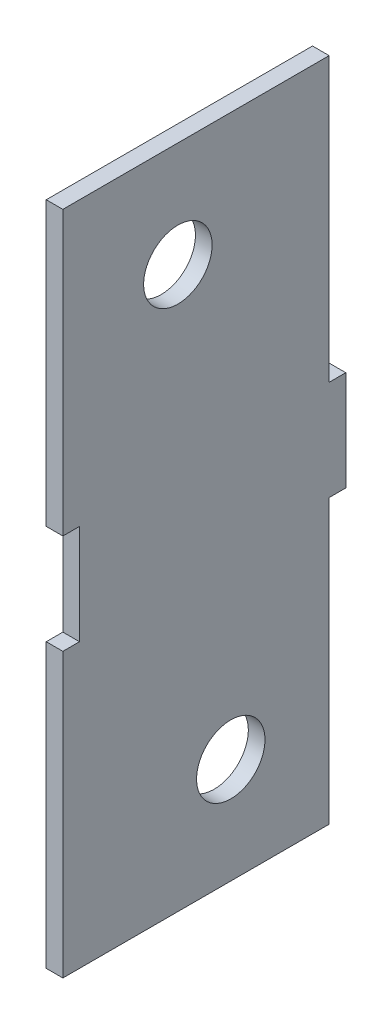
ISO-10303-21;
HEADER;
FILE_DESCRIPTION(('STEP AP214'),'2;1');
FILE_NAME('part.step','',(''),(''),'','','');
FILE_SCHEMA(('AUTOMOTIVE_DESIGN { 1 0 10303 214 1 1 1 1 }'));
ENDSEC;
DATA;
#1=APPLICATION_CONTEXT('core data for automotive mechanical design processes');
#2=APPLICATION_PROTOCOL_DEFINITION('international standard','automotive_design',2000,#1);
#3=PRODUCT_CONTEXT('',#1,'mechanical');
#4=PRODUCT('Part','Part','',(#3));
#5=PRODUCT_RELATED_PRODUCT_CATEGORY('part','',(#4));
#6=PRODUCT_DEFINITION_FORMATION('','',#4);
#7=PRODUCT_DEFINITION_CONTEXT('part definition',#1,'design');
#8=PRODUCT_DEFINITION('design','',#6,#7);
#9=PRODUCT_DEFINITION_SHAPE('','',#8);
#10=(LENGTH_UNIT() NAMED_UNIT(*) SI_UNIT(.MILLI.,.METRE.));
#11=(NAMED_UNIT(*) PLANE_ANGLE_UNIT() SI_UNIT($,.RADIAN.));
#12=(NAMED_UNIT(*) SI_UNIT($,.STERADIAN.) SOLID_ANGLE_UNIT());
#13=UNCERTAINTY_MEASURE_WITH_UNIT(LENGTH_MEASURE(1.E-05),#10,'distance_accuracy_value','');
#14=(GEOMETRIC_REPRESENTATION_CONTEXT(3) GLOBAL_UNCERTAINTY_ASSIGNED_CONTEXT((#13)) GLOBAL_UNIT_ASSIGNED_CONTEXT((#10,
#11,#12)) REPRESENTATION_CONTEXT('',''));
#15=CARTESIAN_POINT('',(0.,0.,0.));
#16=DIRECTION('',(0.,0.,1.));
#17=DIRECTION('',(1.,0.,0.));
#18=AXIS2_PLACEMENT_3D('',#15,#16,#17);
#19=CARTESIAN_POINT('',(1.5875,0.,0.));
#20=DIRECTION('',(-1.,0.,0.));
#21=DIRECTION('',(0.,0.,1.));
#22=AXIS2_PLACEMENT_3D('',#19,#20,#21);
#23=PLANE('',#22);
#24=CARTESIAN_POINT('',(1.5875,-21.6977850407598,-3.31693456022971));
#25=DIRECTION('',(1.,0.,0.));
#26=DIRECTION('',(0.,0.,-1.));
#27=AXIS2_PLACEMENT_3D('',#24,#25,#26);
#28=CIRCLE('',#27,3.2639);
#29=CARTESIAN_POINT('',(1.5875,-21.6977850407598,-6.58083456022971));
#30=VERTEX_POINT('',#29);
#31=EDGE_CURVE('E182',#30,#30,#28,.T.);
#32=ORIENTED_EDGE('',*,*,#31,.F.);
#33=EDGE_LOOP('',(#32));
#34=FACE_BOUND('',#33,.T.);
#35=CARTESIAN_POINT('',(1.5875,21.6977850407598,1.7294345602297));
#36=DIRECTION('',(1.,0.,0.));
#37=DIRECTION('',(0.,0.,-1.));
#38=AXIS2_PLACEMENT_3D('',#35,#36,#37);
#39=CIRCLE('',#38,3.2639);
#40=CARTESIAN_POINT('',(1.5875,21.6977850407598,-1.5344654397703));
#41=VERTEX_POINT('',#40);
#42=EDGE_CURVE('E188',#41,#41,#39,.T.);
#43=ORIENTED_EDGE('',*,*,#42,.F.);
#44=EDGE_LOOP('',(#43));
#45=FACE_BOUND('',#44,.T.);
#46=DIRECTION('',(0.,0.,-1.));
#47=VECTOR('',#46,1.);
#48=CARTESIAN_POINT('',(1.5875,4.7625,12.7));
#49=LINE('',#48,#47);
#50=CARTESIAN_POINT('',(1.5875,4.7625,12.7));
#51=VERTEX_POINT('',#50);
#52=CARTESIAN_POINT('',(1.5875,4.7625,11.1125));
#53=VERTEX_POINT('',#52);
#54=EDGE_CURVE('E135',#51,#53,#49,.T.);
#55=ORIENTED_EDGE('',*,*,#54,.T.);
#56=DIRECTION('',(0.,-1.,0.));
#57=VECTOR('',#56,1.);
#58=CARTESIAN_POINT('',(1.5875,4.7625,11.1125));
#59=LINE('',#58,#57);
#60=CARTESIAN_POINT('',(1.5875,-4.7625,11.1125));
#61=VERTEX_POINT('',#60);
#62=EDGE_CURVE('E143',#53,#61,#59,.T.);
#63=ORIENTED_EDGE('',*,*,#62,.T.);
#64=DIRECTION('',(0.,0.,-1.));
#65=VECTOR('',#64,1.);
#66=CARTESIAN_POINT('',(1.5875,-4.7625,12.7));
#67=LINE('',#66,#65);
#68=CARTESIAN_POINT('',(1.5875,-4.7625,12.7));
#69=VERTEX_POINT('',#68);
#70=EDGE_CURVE('E148',#69,#61,#67,.T.);
#71=ORIENTED_EDGE('',*,*,#70,.F.);
#72=DIRECTION('',(0.,-1.,0.));
#73=VECTOR('',#72,1.);
#74=CARTESIAN_POINT('',(1.5875,-31.75,12.7));
#75=LINE('',#74,#73);
#76=CARTESIAN_POINT('',(1.5875,-31.75,12.7));
#77=VERTEX_POINT('',#76);
#78=EDGE_CURVE('E200',#69,#77,#75,.T.);
#79=ORIENTED_EDGE('',*,*,#78,.T.);
#80=DIRECTION('',(0.,0.,-1.));
#81=VECTOR('',#80,1.);
#82=CARTESIAN_POINT('',(1.5875,-31.75,12.7));
#83=LINE('',#82,#81);
#84=CARTESIAN_POINT('',(1.5875,-31.75,-12.7));
#85=VERTEX_POINT('',#84);
#86=EDGE_CURVE('E202',#77,#85,#83,.T.);
#87=ORIENTED_EDGE('',*,*,#86,.T.);
#88=DIRECTION('',(0.,1.,0.));
#89=VECTOR('',#88,1.);
#90=CARTESIAN_POINT('',(1.5875,-31.75,-12.7));
#91=LINE('',#90,#89);
#92=CARTESIAN_POINT('',(1.5875,-4.7625,-12.7));
#93=VERTEX_POINT('',#92);
#94=EDGE_CURVE('E194',#85,#93,#91,.T.);
#95=ORIENTED_EDGE('',*,*,#94,.T.);
#96=DIRECTION('',(0.,0.,-1.));
#97=VECTOR('',#96,1.);
#98=CARTESIAN_POINT('',(1.5875,-4.7625,-12.7));
#99=LINE('',#98,#97);
#100=CARTESIAN_POINT('',(1.5875,-4.7625,-14.2875));
#101=VERTEX_POINT('',#100);
#102=EDGE_CURVE('E65',#93,#101,#99,.T.);
#103=ORIENTED_EDGE('',*,*,#102,.T.);
#104=DIRECTION('',(0.,-1.,0.));
#105=VECTOR('',#104,1.);
#106=CARTESIAN_POINT('',(1.5875,4.7625,-14.2875));
#107=LINE('',#106,#105);
#108=CARTESIAN_POINT('',(1.5875,4.7625,-14.2875));
#109=VERTEX_POINT('',#108);
#110=EDGE_CURVE('E169',#109,#101,#107,.T.);
#111=ORIENTED_EDGE('',*,*,#110,.F.);
#112=DIRECTION('',(0.,0.,-1.));
#113=VECTOR('',#112,1.);
#114=CARTESIAN_POINT('',(1.5875,4.7625,-12.7));
#115=LINE('',#114,#113);
#116=CARTESIAN_POINT('',(1.5875,4.7625,-12.7));
#117=VERTEX_POINT('',#116);
#118=EDGE_CURVE('E163',#117,#109,#115,.T.);
#119=ORIENTED_EDGE('',*,*,#118,.F.);
#120=CARTESIAN_POINT('',(1.5875,31.75,-12.7));
#121=VERTEX_POINT('',#120);
#122=EDGE_CURVE('E198',#117,#121,#91,.T.);
#123=ORIENTED_EDGE('',*,*,#122,.T.);
#124=DIRECTION('',(0.,0.,1.));
#125=VECTOR('',#124,1.);
#126=CARTESIAN_POINT('',(1.5875,31.75,12.7));
#127=LINE('',#126,#125);
#128=CARTESIAN_POINT('',(1.5875,31.75,12.7));
#129=VERTEX_POINT('',#128);
#130=EDGE_CURVE('E197',#121,#129,#127,.T.);
#131=ORIENTED_EDGE('',*,*,#130,.T.);
#132=EDGE_CURVE('E152',#129,#51,#75,.T.);
#133=ORIENTED_EDGE('',*,*,#132,.T.);
#134=EDGE_LOOP('',(#55,#63,#71,#79,#87,#95,#103,#111,#119,#123,#131,#133));
#135=FACE_BOUND('',#134,.T.);
#136=ADVANCED_FACE('F42',(#34,#45,#135),#23,.F.);
#137=CARTESIAN_POINT('',(0.,0.,0.));
#138=DIRECTION('',(-1.,0.,0.));
#139=DIRECTION('',(0.,0.,1.));
#140=AXIS2_PLACEMENT_3D('',#137,#138,#139);
#141=PLANE('',#140);
#142=CARTESIAN_POINT('',(0.,21.6977850407598,1.7294345602297));
#143=DIRECTION('',(1.,0.,0.));
#144=DIRECTION('',(0.,0.,-1.));
#145=AXIS2_PLACEMENT_3D('',#142,#143,#144);
#146=CIRCLE('',#145,3.2639);
#147=CARTESIAN_POINT('',(0.,21.6977850407598,-1.5344654397703));
#148=VERTEX_POINT('',#147);
#149=EDGE_CURVE('E185',#148,#148,#146,.T.);
#150=ORIENTED_EDGE('',*,*,#149,.T.);
#151=EDGE_LOOP('',(#150));
#152=FACE_BOUND('',#151,.T.);
#153=CARTESIAN_POINT('',(0.,-21.6977850407598,-3.31693456022971));
#154=DIRECTION('',(1.,0.,0.));
#155=DIRECTION('',(0.,0.,-1.));
#156=AXIS2_PLACEMENT_3D('',#153,#154,#155);
#157=CIRCLE('',#156,3.2639);
#158=CARTESIAN_POINT('',(0.,-21.6977850407598,-6.58083456022971));
#159=VERTEX_POINT('',#158);
#160=EDGE_CURVE('E175',#159,#159,#157,.T.);
#161=ORIENTED_EDGE('',*,*,#160,.T.);
#162=EDGE_LOOP('',(#161));
#163=FACE_BOUND('',#162,.T.);
#164=DIRECTION('',(0.,1.,0.));
#165=VECTOR('',#164,1.);
#166=CARTESIAN_POINT('',(0.,0.,11.1125));
#167=LINE('',#166,#165);
#168=CARTESIAN_POINT('',(0.,-4.7625,11.1125));
#169=VERTEX_POINT('',#168);
#170=CARTESIAN_POINT('',(0.,4.7625,11.1125));
#171=VERTEX_POINT('',#170);
#172=EDGE_CURVE('E11',#169,#171,#167,.T.);
#173=ORIENTED_EDGE('',*,*,#172,.T.);
#174=DIRECTION('',(0.,0.,1.));
#175=VECTOR('',#174,1.);
#176=CARTESIAN_POINT('',(0.,4.7625,0.));
#177=LINE('',#176,#175);
#178=CARTESIAN_POINT('',(0.,4.7625,12.7));
#179=VERTEX_POINT('',#178);
#180=EDGE_CURVE('E138',#171,#179,#177,.T.);
#181=ORIENTED_EDGE('',*,*,#180,.T.);
#182=DIRECTION('',(0.,-1.,0.));
#183=VECTOR('',#182,1.);
#184=CARTESIAN_POINT('',(0.,-31.75,12.7));
#185=LINE('',#184,#183);
#186=CARTESIAN_POINT('',(0.,31.75,12.7));
#187=VERTEX_POINT('',#186);
#188=EDGE_CURVE('E211',#187,#179,#185,.T.);
#189=ORIENTED_EDGE('',*,*,#188,.F.);
#190=DIRECTION('',(0.,0.,1.));
#191=VECTOR('',#190,1.);
#192=CARTESIAN_POINT('',(0.,31.75,12.7));
#193=LINE('',#192,#191);
#194=CARTESIAN_POINT('',(0.,31.75,-12.7));
#195=VERTEX_POINT('',#194);
#196=EDGE_CURVE('E208',#195,#187,#193,.T.);
#197=ORIENTED_EDGE('',*,*,#196,.F.);
#198=DIRECTION('',(0.,1.,0.));
#199=VECTOR('',#198,1.);
#200=CARTESIAN_POINT('',(0.,-31.75,-12.7));
#201=LINE('',#200,#199);
#202=CARTESIAN_POINT('',(0.,4.7625,-12.7));
#203=VERTEX_POINT('',#202);
#204=EDGE_CURVE('E191',#203,#195,#201,.T.);
#205=ORIENTED_EDGE('',*,*,#204,.F.);
#206=DIRECTION('',(0.,0.,-1.));
#207=VECTOR('',#206,1.);
#208=CARTESIAN_POINT('',(0.,4.7625,-12.7));
#209=LINE('',#208,#207);
#210=CARTESIAN_POINT('',(0.,4.7625,-14.2875));
#211=VERTEX_POINT('',#210);
#212=EDGE_CURVE('E165',#203,#211,#209,.T.);
#213=ORIENTED_EDGE('',*,*,#212,.T.);
#214=DIRECTION('',(0.,-1.,0.));
#215=VECTOR('',#214,1.);
#216=CARTESIAN_POINT('',(0.,4.7625,-14.2875));
#217=LINE('',#216,#215);
#218=CARTESIAN_POINT('',(0.,-4.7625,-14.2875));
#219=VERTEX_POINT('',#218);
#220=EDGE_CURVE('E162',#211,#219,#217,.T.);
#221=ORIENTED_EDGE('',*,*,#220,.T.);
#222=DIRECTION('',(0.,0.,-1.));
#223=VECTOR('',#222,1.);
#224=CARTESIAN_POINT('',(0.,-4.7625,-12.7));
#225=LINE('',#224,#223);
#226=CARTESIAN_POINT('',(0.,-4.7625,-12.7));
#227=VERTEX_POINT('',#226);
#228=EDGE_CURVE('E159',#227,#219,#225,.T.);
#229=ORIENTED_EDGE('',*,*,#228,.F.);
#230=CARTESIAN_POINT('',(0.,-31.75,-12.7));
#231=VERTEX_POINT('',#230);
#232=EDGE_CURVE('E205',#231,#227,#201,.T.);
#233=ORIENTED_EDGE('',*,*,#232,.F.);
#234=DIRECTION('',(0.,0.,-1.));
#235=VECTOR('',#234,1.);
#236=CARTESIAN_POINT('',(0.,-31.75,12.7));
#237=LINE('',#236,#235);
#238=CARTESIAN_POINT('',(0.,-31.75,12.7));
#239=VERTEX_POINT('',#238);
#240=EDGE_CURVE('E214',#239,#231,#237,.T.);
#241=ORIENTED_EDGE('',*,*,#240,.F.);
#242=CARTESIAN_POINT('',(0.,-4.7625,12.7));
#243=VERTEX_POINT('',#242);
#244=EDGE_CURVE('E210',#243,#239,#185,.T.);
#245=ORIENTED_EDGE('',*,*,#244,.F.);
#246=DIRECTION('',(0.,0.,1.));
#247=VECTOR('',#246,1.);
#248=CARTESIAN_POINT('',(0.,-4.76249999999999,0.));
#249=LINE('',#248,#247);
#250=EDGE_CURVE('E57',#169,#243,#249,.T.);
#251=ORIENTED_EDGE('',*,*,#250,.F.);
#252=EDGE_LOOP('',(#173,#181,#189,#197,#205,#213,#221,#229,#233,#241,#245,#251));
#253=FACE_BOUND('',#252,.T.);
#254=ADVANCED_FACE('F231',(#152,#163,#253),#141,.T.);
#255=CARTESIAN_POINT('',(1.5875,-31.75,12.7));
#256=DIRECTION('',(0.,0.,-1.));
#257=DIRECTION('',(-1.,0.,0.));
#258=AXIS2_PLACEMENT_3D('',#255,#256,#257);
#259=PLANE('',#258);
#260=DIRECTION('',(-1.,0.,0.));
#261=VECTOR('',#260,1.);
#262=CARTESIAN_POINT('',(1.5875,4.7625,12.7));
#263=LINE('',#262,#261);
#264=EDGE_CURVE('E50',#51,#179,#263,.T.);
#265=ORIENTED_EDGE('',*,*,#264,.F.);
#266=ORIENTED_EDGE('',*,*,#132,.F.);
#267=DIRECTION('',(-1.,0.,0.));
#268=VECTOR('',#267,1.);
#269=CARTESIAN_POINT('',(1.5875,31.75,12.7));
#270=LINE('',#269,#268);
#271=EDGE_CURVE('E221',#129,#187,#270,.T.);
#272=ORIENTED_EDGE('',*,*,#271,.T.);
#273=ORIENTED_EDGE('',*,*,#188,.T.);
#274=EDGE_LOOP('',(#265,#266,#272,#273));
#275=FACE_BOUND('',#274,.T.);
#276=ADVANCED_FACE('F233',(#275),#259,.F.);
#277=CARTESIAN_POINT('',(1.5875,-31.75,-12.7));
#278=DIRECTION('',(0.,0.,1.));
#279=DIRECTION('',(1.,0.,0.));
#280=AXIS2_PLACEMENT_3D('',#277,#278,#279);
#281=PLANE('',#280);
#282=DIRECTION('',(1.,0.,0.));
#283=VECTOR('',#282,1.);
#284=CARTESIAN_POINT('',(0.,4.7625,-12.7));
#285=LINE('',#284,#283);
#286=EDGE_CURVE('E176',#203,#117,#285,.T.);
#287=ORIENTED_EDGE('',*,*,#286,.F.);
#288=ORIENTED_EDGE('',*,*,#204,.T.);
#289=DIRECTION('',(-1.,0.,0.));
#290=VECTOR('',#289,1.);
#291=CARTESIAN_POINT('',(1.5875,31.75,-12.7));
#292=LINE('',#291,#290);
#293=EDGE_CURVE('E224',#121,#195,#292,.T.);
#294=ORIENTED_EDGE('',*,*,#293,.F.);
#295=ORIENTED_EDGE('',*,*,#122,.F.);
#296=EDGE_LOOP('',(#287,#288,#294,#295));
#297=FACE_BOUND('',#296,.T.);
#298=ADVANCED_FACE('F243',(#297),#281,.F.);
#299=ORIENTED_EDGE('',*,*,#232,.T.);
#300=DIRECTION('',(1.,0.,0.));
#301=VECTOR('',#300,1.);
#302=CARTESIAN_POINT('',(0.,-4.7625,-12.7));
#303=LINE('',#302,#301);
#304=EDGE_CURVE('E173',#227,#93,#303,.T.);
#305=ORIENTED_EDGE('',*,*,#304,.T.);
#306=ORIENTED_EDGE('',*,*,#94,.F.);
#307=DIRECTION('',(-1.,0.,0.));
#308=VECTOR('',#307,1.);
#309=CARTESIAN_POINT('',(1.5875,-31.75,-12.7));
#310=LINE('',#309,#308);
#311=EDGE_CURVE('E204',#85,#231,#310,.T.);
#312=ORIENTED_EDGE('',*,*,#311,.T.);
#313=EDGE_LOOP('',(#299,#305,#306,#312));
#314=FACE_BOUND('',#313,.T.);
#315=ADVANCED_FACE('F44',(#314),#281,.F.);
#316=CARTESIAN_POINT('',(1.5875,31.75,12.7));
#317=DIRECTION('',(0.,-1.,0.));
#318=DIRECTION('',(0.,0.,-1.));
#319=AXIS2_PLACEMENT_3D('',#316,#317,#318);
#320=PLANE('',#319);
#321=ORIENTED_EDGE('',*,*,#196,.T.);
#322=ORIENTED_EDGE('',*,*,#271,.F.);
#323=ORIENTED_EDGE('',*,*,#130,.F.);
#324=ORIENTED_EDGE('',*,*,#293,.T.);
#325=EDGE_LOOP('',(#321,#322,#323,#324));
#326=FACE_BOUND('',#325,.T.);
#327=ADVANCED_FACE('F237',(#326),#320,.F.);
#328=ORIENTED_EDGE('',*,*,#78,.F.);
#329=DIRECTION('',(-1.,0.,0.));
#330=VECTOR('',#329,1.);
#331=CARTESIAN_POINT('',(1.5875,-4.7625,12.7));
#332=LINE('',#331,#330);
#333=EDGE_CURVE('E227',#69,#243,#332,.T.);
#334=ORIENTED_EDGE('',*,*,#333,.T.);
#335=ORIENTED_EDGE('',*,*,#244,.T.);
#336=DIRECTION('',(-1.,0.,0.));
#337=VECTOR('',#336,1.);
#338=CARTESIAN_POINT('',(1.5875,-31.75,12.7));
#339=LINE('',#338,#337);
#340=EDGE_CURVE('E218',#77,#239,#339,.T.);
#341=ORIENTED_EDGE('',*,*,#340,.F.);
#342=EDGE_LOOP('',(#328,#334,#335,#341));
#343=FACE_BOUND('',#342,.T.);
#344=ADVANCED_FACE('F266',(#343),#259,.F.);
#345=CARTESIAN_POINT('',(1.5875,-31.75,12.7));
#346=DIRECTION('',(0.,1.,0.));
#347=DIRECTION('',(0.,0.,1.));
#348=AXIS2_PLACEMENT_3D('',#345,#346,#347);
#349=PLANE('',#348);
#350=ORIENTED_EDGE('',*,*,#240,.T.);
#351=ORIENTED_EDGE('',*,*,#311,.F.);
#352=ORIENTED_EDGE('',*,*,#86,.F.);
#353=ORIENTED_EDGE('',*,*,#340,.T.);
#354=EDGE_LOOP('',(#350,#351,#352,#353));
#355=FACE_BOUND('',#354,.T.);
#356=ADVANCED_FACE('F261',(#355),#349,.F.);
#357=CARTESIAN_POINT('',(1.5875,21.6977850407598,1.7294345602297));
#358=DIRECTION('',(-1.,0.,0.));
#359=DIRECTION('',(0.,0.,1.));
#360=AXIS2_PLACEMENT_3D('',#357,#358,#359);
#361=CYLINDRICAL_SURFACE('',#360,3.2639);
#362=ORIENTED_EDGE('',*,*,#42,.T.);
#363=EDGE_LOOP('',(#362));
#364=FACE_BOUND('',#363,.T.);
#365=ORIENTED_EDGE('',*,*,#149,.F.);
#366=EDGE_LOOP('',(#365));
#367=FACE_BOUND('',#366,.T.);
#368=ADVANCED_FACE('F286',(#364,#367),#361,.F.);
#369=CARTESIAN_POINT('',(1.5875,-21.6977850407598,-3.31693456022971));
#370=DIRECTION('',(-1.,0.,0.));
#371=DIRECTION('',(0.,0.,1.));
#372=AXIS2_PLACEMENT_3D('',#369,#370,#371);
#373=CYLINDRICAL_SURFACE('',#372,3.2639);
#374=ORIENTED_EDGE('',*,*,#31,.T.);
#375=EDGE_LOOP('',(#374));
#376=FACE_BOUND('',#375,.T.);
#377=ORIENTED_EDGE('',*,*,#160,.F.);
#378=EDGE_LOOP('',(#377));
#379=FACE_BOUND('',#378,.T.);
#380=ADVANCED_FACE('F364',(#376,#379),#373,.F.);
#381=CARTESIAN_POINT('',(0.,-4.7625,-12.7));
#382=DIRECTION('',(0.,-1.,0.));
#383=DIRECTION('',(0.,0.,-1.));
#384=AXIS2_PLACEMENT_3D('',#381,#382,#383);
#385=PLANE('',#384);
#386=ORIENTED_EDGE('',*,*,#102,.F.);
#387=ORIENTED_EDGE('',*,*,#304,.F.);
#388=ORIENTED_EDGE('',*,*,#228,.T.);
#389=DIRECTION('',(1.,0.,0.));
#390=VECTOR('',#389,1.);
#391=CARTESIAN_POINT('',(0.,-4.7625,-14.2875));
#392=LINE('',#391,#390);
#393=EDGE_CURVE('E167',#219,#101,#392,.T.);
#394=ORIENTED_EDGE('',*,*,#393,.T.);
#395=EDGE_LOOP('',(#386,#387,#388,#394));
#396=FACE_BOUND('',#395,.T.);
#397=ADVANCED_FACE('F357',(#396),#385,.T.);
#398=CARTESIAN_POINT('',(0.,4.7625,-12.7));
#399=DIRECTION('',(0.,-1.,0.));
#400=DIRECTION('',(0.,0.,-1.));
#401=AXIS2_PLACEMENT_3D('',#398,#399,#400);
#402=PLANE('',#401);
#403=ORIENTED_EDGE('',*,*,#118,.T.);
#404=DIRECTION('',(1.,0.,0.));
#405=VECTOR('',#404,1.);
#406=CARTESIAN_POINT('',(0.,4.7625,-14.2875));
#407=LINE('',#406,#405);
#408=EDGE_CURVE('E178',#211,#109,#407,.T.);
#409=ORIENTED_EDGE('',*,*,#408,.F.);
#410=ORIENTED_EDGE('',*,*,#212,.F.);
#411=ORIENTED_EDGE('',*,*,#286,.T.);
#412=EDGE_LOOP('',(#403,#409,#410,#411));
#413=FACE_BOUND('',#412,.T.);
#414=ADVANCED_FACE('F247',(#413),#402,.F.);
#415=CARTESIAN_POINT('',(0.,4.7625,-14.2875));
#416=DIRECTION('',(0.,0.,1.));
#417=DIRECTION('',(1.,0.,0.));
#418=AXIS2_PLACEMENT_3D('',#415,#416,#417);
#419=PLANE('',#418);
#420=ORIENTED_EDGE('',*,*,#110,.T.);
#421=ORIENTED_EDGE('',*,*,#393,.F.);
#422=ORIENTED_EDGE('',*,*,#220,.F.);
#423=ORIENTED_EDGE('',*,*,#408,.T.);
#424=EDGE_LOOP('',(#420,#421,#422,#423));
#425=FACE_BOUND('',#424,.T.);
#426=ADVANCED_FACE('F251',(#425),#419,.F.);
#427=CARTESIAN_POINT('',(-1.5875,4.7625,12.7));
#428=DIRECTION('',(0.,-1.,0.));
#429=DIRECTION('',(0.,0.,-1.));
#430=AXIS2_PLACEMENT_3D('',#427,#428,#429);
#431=PLANE('',#430);
#432=DIRECTION('',(1.,0.,0.));
#433=VECTOR('',#432,1.);
#434=CARTESIAN_POINT('',(-1.5875,4.7625,11.1125));
#435=LINE('',#434,#433);
#436=EDGE_CURVE('E131',#171,#53,#435,.T.);
#437=ORIENTED_EDGE('',*,*,#436,.T.);
#438=ORIENTED_EDGE('',*,*,#54,.F.);
#439=ORIENTED_EDGE('',*,*,#264,.T.);
#440=ORIENTED_EDGE('',*,*,#180,.F.);
#441=EDGE_LOOP('',(#437,#438,#439,#440));
#442=FACE_BOUND('',#441,.T.);
#443=ADVANCED_FACE('F133',(#442),#431,.T.);
#444=CARTESIAN_POINT('',(-1.5875,4.7625,11.1125));
#445=DIRECTION('',(0.,0.,1.));
#446=DIRECTION('',(1.,0.,0.));
#447=AXIS2_PLACEMENT_3D('',#444,#445,#446);
#448=PLANE('',#447);
#449=DIRECTION('',(1.,0.,0.));
#450=VECTOR('',#449,1.);
#451=CARTESIAN_POINT('',(-1.5875,-4.7625,11.1125));
#452=LINE('',#451,#450);
#453=EDGE_CURVE('E140',#169,#61,#452,.T.);
#454=ORIENTED_EDGE('',*,*,#453,.T.);
#455=ORIENTED_EDGE('',*,*,#62,.F.);
#456=ORIENTED_EDGE('',*,*,#436,.F.);
#457=ORIENTED_EDGE('',*,*,#172,.F.);
#458=EDGE_LOOP('',(#454,#455,#456,#457));
#459=FACE_BOUND('',#458,.T.);
#460=ADVANCED_FACE('F144',(#459),#448,.T.);
#461=CARTESIAN_POINT('',(-1.5875,-4.7625,12.7));
#462=DIRECTION('',(0.,-1.,0.));
#463=DIRECTION('',(0.,0.,-1.));
#464=AXIS2_PLACEMENT_3D('',#461,#462,#463);
#465=PLANE('',#464);
#466=ORIENTED_EDGE('',*,*,#250,.T.);
#467=ORIENTED_EDGE('',*,*,#333,.F.);
#468=ORIENTED_EDGE('',*,*,#70,.T.);
#469=ORIENTED_EDGE('',*,*,#453,.F.);
#470=EDGE_LOOP('',(#466,#467,#468,#469));
#471=FACE_BOUND('',#470,.T.);
#472=ADVANCED_FACE('F267',(#471),#465,.F.);
#473=CLOSED_SHELL('',(#136,#254,#276,#298,#315,#327,#344,#356,#368,#380,#397,#414,#426,#443,
#460,#472));
#474=MANIFOLD_SOLID_BREP('B2',#473);
#475=ADVANCED_BREP_SHAPE_REPRESENTATION('',(#18,#474),#14);
#476=SHAPE_DEFINITION_REPRESENTATION(#9,#475);
ENDSEC;
END-ISO-10303-21;
